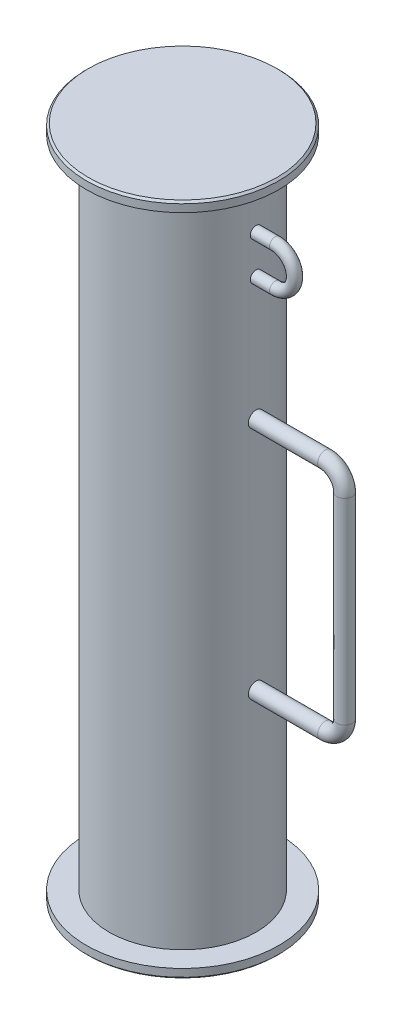
ISO-10303-21;
HEADER;
FILE_DESCRIPTION(('STEP AP214'),'2;1');
FILE_NAME('part.step','',(''),(''),'','','');
FILE_SCHEMA(('AUTOMOTIVE_DESIGN { 1 0 10303 214 1 1 1 1 }'));
ENDSEC;
DATA;
#1=APPLICATION_CONTEXT('core data for automotive mechanical design processes');
#2=APPLICATION_PROTOCOL_DEFINITION('international standard','automotive_design',2000,#1);
#3=PRODUCT_CONTEXT('',#1,'mechanical');
#4=PRODUCT('Part','Part','',(#3));
#5=PRODUCT_RELATED_PRODUCT_CATEGORY('part','',(#4));
#6=PRODUCT_DEFINITION_FORMATION('','',#4);
#7=PRODUCT_DEFINITION_CONTEXT('part definition',#1,'design');
#8=PRODUCT_DEFINITION('design','',#6,#7);
#9=PRODUCT_DEFINITION_SHAPE('','',#8);
#10=(LENGTH_UNIT() NAMED_UNIT(*) SI_UNIT(.MILLI.,.METRE.));
#11=(NAMED_UNIT(*) PLANE_ANGLE_UNIT() SI_UNIT($,.RADIAN.));
#12=(NAMED_UNIT(*) SI_UNIT($,.STERADIAN.) SOLID_ANGLE_UNIT());
#13=UNCERTAINTY_MEASURE_WITH_UNIT(LENGTH_MEASURE(1.E-05),#10,'distance_accuracy_value','');
#14=(GEOMETRIC_REPRESENTATION_CONTEXT(3) GLOBAL_UNCERTAINTY_ASSIGNED_CONTEXT((#13)) GLOBAL_UNIT_ASSIGNED_CONTEXT((#10,
#11,#12)) REPRESENTATION_CONTEXT('',''));
#15=CARTESIAN_POINT('',(0.,0.,0.));
#16=DIRECTION('',(0.,0.,1.));
#17=DIRECTION('',(1.,0.,0.));
#18=AXIS2_PLACEMENT_3D('',#15,#16,#17);
#19=CARTESIAN_POINT('',(48.15,-30.,0.));
#20=DIRECTION('',(-1.,0.,0.));
#21=DIRECTION('',(0.,-1.,0.));
#22=AXIS2_PLACEMENT_3D('',#19,#20,#21);
#23=CYLINDRICAL_SURFACE('',#22,3.);
#24=CARTESIAN_POINT('',(48.15,-30.,0.));
#25=DIRECTION('',(-1.,0.,0.));
#26=DIRECTION('',(0.,0.,-1.));
#27=AXIS2_PLACEMENT_3D('',#24,#25,#26);
#28=CIRCLE('',#27,3.);
#29=CARTESIAN_POINT('',(48.15,-27.,0.));
#30=VERTEX_POINT('',#29);
#31=EDGE_CURVE('E49',#30,#30,#28,.T.);
#32=ORIENTED_EDGE('',*,*,#31,.T.);
#33=EDGE_LOOP('',(#32));
#34=FACE_BOUND('',#33,.T.);
#35=CARTESIAN_POINT('',(38.15,-30.,0.));
#36=DIRECTION('',(-1.,0.,0.));
#37=DIRECTION('',(0.,0.,-1.));
#38=AXIS2_PLACEMENT_3D('',#35,#36,#37);
#39=CIRCLE('',#38,3.);
#40=CARTESIAN_POINT('',(38.15,-30.,-3.));
#41=VERTEX_POINT('',#40);
#42=EDGE_CURVE('E11',#41,#41,#39,.T.);
#43=ORIENTED_EDGE('',*,*,#42,.F.);
#44=EDGE_LOOP('',(#43));
#45=FACE_BOUND('',#44,.T.);
#46=ADVANCED_FACE('F43',(#34,#45),#23,.T.);
#47=CARTESIAN_POINT('',(48.15,-40.,0.));
#48=DIRECTION('',(0.,0.,1.));
#49=DIRECTION('',(1.,0.,0.));
#50=AXIS2_PLACEMENT_3D('',#47,#48,#49);
#51=TOROIDAL_SURFACE('',#50,9.99999999999999,3.);
#52=CARTESIAN_POINT('',(48.15,-50.,0.));
#53=DIRECTION('',(1.,0.,0.));
#54=DIRECTION('',(0.,0.,-1.));
#55=AXIS2_PLACEMENT_3D('',#52,#53,#54);
#56=CIRCLE('',#55,3.);
#57=CARTESIAN_POINT('',(48.15,-53.,0.));
#58=VERTEX_POINT('',#57);
#59=EDGE_CURVE('E53',#58,#58,#56,.T.);
#60=CARTESIAN_POINT('',(48.15,-40.,0.));
#61=DIRECTION('',(0.,0.,1.));
#62=DIRECTION('',(1.,0.,0.));
#63=AXIS2_PLACEMENT_3D('',#60,#61,#62);
#64=CIRCLE('',#63,13.);
#65=EDGE_CURVE('',#58,#30,#64,.T.);
#66=ORIENTED_EDGE('',*,*,#59,.T.);
#67=ORIENTED_EDGE('',*,*,#31,.F.);
#68=ORIENTED_EDGE('',*,*,#65,.T.);
#69=ORIENTED_EDGE('',*,*,#65,.F.);
#70=EDGE_LOOP('',(#66,#68,#67,#69));
#71=FACE_BOUND('',#70,.T.);
#72=ADVANCED_FACE('F75',(#71),#51,.T.);
#73=CARTESIAN_POINT('',(48.15,-50.,0.));
#74=DIRECTION('',(-1.,0.,0.));
#75=DIRECTION('',(0.,0.,1.));
#76=AXIS2_PLACEMENT_3D('',#73,#74,#75);
#77=CYLINDRICAL_SURFACE('',#76,3.);
#78=ORIENTED_EDGE('',*,*,#59,.F.);
#79=EDGE_LOOP('',(#78));
#80=FACE_BOUND('',#79,.T.);
#81=CARTESIAN_POINT('',(38.15,-50.,0.));
#82=DIRECTION('',(1.,0.,0.));
#83=DIRECTION('',(0.,0.,-1.));
#84=AXIS2_PLACEMENT_3D('',#81,#82,#83);
#85=CIRCLE('',#84,3.);
#86=CARTESIAN_POINT('',(38.15,-50.,-3.));
#87=VERTEX_POINT('',#86);
#88=EDGE_CURVE('E57',#87,#87,#85,.T.);
#89=ORIENTED_EDGE('',*,*,#88,.T.);
#90=EDGE_LOOP('',(#89));
#91=FACE_BOUND('',#90,.T.);
#92=ADVANCED_FACE('F63',(#80,#91),#77,.T.);
#93=CARTESIAN_POINT('',(38.15,-30.,0.));
#94=DIRECTION('',(-1.,0.,0.));
#95=DIRECTION('',(0.,0.,-1.));
#96=AXIS2_PLACEMENT_3D('',#93,#94,#95);
#97=PLANE('',#96);
#98=ORIENTED_EDGE('',*,*,#42,.T.);
#99=EDGE_LOOP('',(#98));
#100=FACE_BOUND('',#99,.T.);
#101=ADVANCED_FACE('F67',(#100),#97,.T.);
#102=CARTESIAN_POINT('',(38.15,-50.,0.));
#103=DIRECTION('',(1.,0.,0.));
#104=DIRECTION('',(0.,0.,-1.));
#105=AXIS2_PLACEMENT_3D('',#102,#103,#104);
#106=PLANE('',#105);
#107=ORIENTED_EDGE('',*,*,#88,.F.);
#108=EDGE_LOOP('',(#107));
#109=FACE_BOUND('',#108,.T.);
#110=ADVANCED_FACE('F65',(#109),#106,.F.);
#111=CLOSED_SHELL('',(#46,#72,#92,#101,#110));
#112=MANIFOLD_SOLID_BREP('B2',#111);
#113=CARTESIAN_POINT('',(74.15,-236.,0.));
#114=DIRECTION('',(-1.,0.,0.));
#115=DIRECTION('',(0.,0.,1.));
#116=AXIS2_PLACEMENT_3D('',#113,#114,#115);
#117=CYLINDRICAL_SURFACE('',#116,4.00000000000001);
#118=CARTESIAN_POINT('',(74.15,-236.,0.));
#119=DIRECTION('',(-1.,0.,0.));
#120=DIRECTION('',(0.,0.,-1.));
#121=AXIS2_PLACEMENT_3D('',#118,#119,#120);
#122=CIRCLE('',#121,4.00000000000001);
#123=CARTESIAN_POINT('',(74.15,-240.,0.));
#124=VERTEX_POINT('',#123);
#125=EDGE_CURVE('E126',#124,#124,#122,.T.);
#126=ORIENTED_EDGE('',*,*,#125,.T.);
#127=EDGE_LOOP('',(#126));
#128=FACE_BOUND('',#127,.T.);
#129=CARTESIAN_POINT('',(38.15,-236.,0.));
#130=DIRECTION('',(-1.,0.,0.));
#131=DIRECTION('',(0.,0.,-1.));
#132=AXIS2_PLACEMENT_3D('',#129,#130,#131);
#133=CIRCLE('',#132,4.00000000000001);
#134=CARTESIAN_POINT('',(38.15,-236.,-4.00000000000001));
#135=VERTEX_POINT('',#134);
#136=EDGE_CURVE('E42',#135,#135,#133,.T.);
#137=ORIENTED_EDGE('',*,*,#136,.F.);
#138=EDGE_LOOP('',(#137));
#139=FACE_BOUND('',#138,.T.);
#140=ADVANCED_FACE('F120',(#128,#139),#117,.T.);
#141=CARTESIAN_POINT('',(74.15,-226.,0.));
#142=DIRECTION('',(0.,0.,-1.));
#143=DIRECTION('',(-1.,0.,0.));
#144=AXIS2_PLACEMENT_3D('',#141,#142,#143);
#145=TOROIDAL_SURFACE('',#144,9.99999999999997,4.00000000000001);
#146=CARTESIAN_POINT('',(84.15,-226.,0.));
#147=DIRECTION('',(0.,-1.,0.));
#148=DIRECTION('',(0.,0.,-1.));
#149=AXIS2_PLACEMENT_3D('',#146,#147,#148);
#150=CIRCLE('',#149,4.00000000000001);
#151=CARTESIAN_POINT('',(88.15,-226.,0.));
#152=VERTEX_POINT('',#151);
#153=EDGE_CURVE('E130',#152,#152,#150,.T.);
#154=CARTESIAN_POINT('',(74.15,-226.,0.));
#155=DIRECTION('',(0.,0.,-1.));
#156=DIRECTION('',(-1.,0.,0.));
#157=AXIS2_PLACEMENT_3D('',#154,#155,#156);
#158=CIRCLE('',#157,14.);
#159=EDGE_CURVE('',#152,#124,#158,.T.);
#160=ORIENTED_EDGE('',*,*,#153,.T.);
#161=ORIENTED_EDGE('',*,*,#125,.F.);
#162=ORIENTED_EDGE('',*,*,#159,.T.);
#163=ORIENTED_EDGE('',*,*,#159,.F.);
#164=EDGE_LOOP('',(#160,#162,#161,#163));
#165=FACE_BOUND('',#164,.T.);
#166=ADVANCED_FACE('F164',(#165),#145,.T.);
#167=CARTESIAN_POINT('',(84.15,-124.,0.));
#168=DIRECTION('',(0.,-1.,0.));
#169=DIRECTION('',(0.,0.,-1.));
#170=AXIS2_PLACEMENT_3D('',#167,#168,#169);
#171=CYLINDRICAL_SURFACE('',#170,4.00000000000001);
#172=CARTESIAN_POINT('',(84.15,-124.,0.));
#173=DIRECTION('',(0.,-1.,0.));
#174=DIRECTION('',(0.,0.,-1.));
#175=AXIS2_PLACEMENT_3D('',#172,#173,#174);
#176=CIRCLE('',#175,4.00000000000001);
#177=CARTESIAN_POINT('',(88.15,-124.,0.));
#178=VERTEX_POINT('',#177);
#179=EDGE_CURVE('E134',#178,#178,#176,.T.);
#180=ORIENTED_EDGE('',*,*,#179,.T.);
#181=EDGE_LOOP('',(#180));
#182=FACE_BOUND('',#181,.T.);
#183=ORIENTED_EDGE('',*,*,#153,.F.);
#184=EDGE_LOOP('',(#183));
#185=FACE_BOUND('',#184,.T.);
#186=ADVANCED_FACE('F168',(#182,#185),#171,.T.);
#187=CARTESIAN_POINT('',(74.15,-124.,0.));
#188=DIRECTION('',(0.,0.,-1.));
#189=DIRECTION('',(-1.,0.,0.));
#190=AXIS2_PLACEMENT_3D('',#187,#188,#189);
#191=TOROIDAL_SURFACE('',#190,9.99999999999999,4.00000000000001);
#192=CARTESIAN_POINT('',(74.15,-114.,0.));
#193=DIRECTION('',(1.,0.,0.));
#194=DIRECTION('',(0.,0.,-1.));
#195=AXIS2_PLACEMENT_3D('',#192,#193,#194);
#196=CIRCLE('',#195,4.00000000000001);
#197=CARTESIAN_POINT('',(74.15,-110.,0.));
#198=VERTEX_POINT('',#197);
#199=EDGE_CURVE('E139',#198,#198,#196,.T.);
#200=CARTESIAN_POINT('',(74.15,-124.,0.));
#201=DIRECTION('',(0.,0.,-1.));
#202=DIRECTION('',(-1.,0.,0.));
#203=AXIS2_PLACEMENT_3D('',#200,#201,#202);
#204=CIRCLE('',#203,14.);
#205=EDGE_CURVE('',#198,#178,#204,.T.);
#206=ORIENTED_EDGE('',*,*,#199,.T.);
#207=ORIENTED_EDGE('',*,*,#179,.F.);
#208=ORIENTED_EDGE('',*,*,#205,.T.);
#209=ORIENTED_EDGE('',*,*,#205,.F.);
#210=EDGE_LOOP('',(#206,#208,#207,#209));
#211=FACE_BOUND('',#210,.T.);
#212=ADVANCED_FACE('F146',(#211),#191,.T.);
#213=CARTESIAN_POINT('',(74.15,-114.,0.));
#214=DIRECTION('',(-1.,0.,0.));
#215=DIRECTION('',(0.,0.,1.));
#216=AXIS2_PLACEMENT_3D('',#213,#214,#215);
#217=CYLINDRICAL_SURFACE('',#216,4.00000000000001);
#218=ORIENTED_EDGE('',*,*,#199,.F.);
#219=EDGE_LOOP('',(#218));
#220=FACE_BOUND('',#219,.T.);
#221=CARTESIAN_POINT('',(38.15,-114.,0.));
#222=DIRECTION('',(1.,0.,0.));
#223=DIRECTION('',(0.,0.,-1.));
#224=AXIS2_PLACEMENT_3D('',#221,#222,#223);
#225=CIRCLE('',#224,4.00000000000001);
#226=CARTESIAN_POINT('',(38.15,-114.,-4.00000000000001));
#227=VERTEX_POINT('',#226);
#228=EDGE_CURVE('E140',#227,#227,#225,.T.);
#229=ORIENTED_EDGE('',*,*,#228,.T.);
#230=EDGE_LOOP('',(#229));
#231=FACE_BOUND('',#230,.T.);
#232=ADVANCED_FACE('F149',(#220,#231),#217,.T.);
#233=CARTESIAN_POINT('',(38.15,-236.,0.));
#234=DIRECTION('',(-1.,0.,0.));
#235=DIRECTION('',(0.,0.,-1.));
#236=AXIS2_PLACEMENT_3D('',#233,#234,#235);
#237=PLANE('',#236);
#238=ORIENTED_EDGE('',*,*,#136,.T.);
#239=EDGE_LOOP('',(#238));
#240=FACE_BOUND('',#239,.T.);
#241=ADVANCED_FACE('F152',(#240),#237,.T.);
#242=CARTESIAN_POINT('',(38.15,-114.,0.));
#243=DIRECTION('',(1.,0.,0.));
#244=DIRECTION('',(0.,0.,-1.));
#245=AXIS2_PLACEMENT_3D('',#242,#243,#244);
#246=PLANE('',#245);
#247=ORIENTED_EDGE('',*,*,#228,.F.);
#248=EDGE_LOOP('',(#247));
#249=FACE_BOUND('',#248,.T.);
#250=ADVANCED_FACE('F156',(#249),#246,.F.);
#251=CLOSED_SHELL('',(#140,#166,#186,#212,#232,#241,#250));
#252=MANIFOLD_SOLID_BREP('B6',#251);
#253=CARTESIAN_POINT('',(0.,-5.,0.));
#254=DIRECTION('',(0.,1.,0.));
#255=DIRECTION('',(0.,0.,1.));
#256=AXIS2_PLACEMENT_3D('',#253,#254,#255);
#257=PLANE('',#256);
#258=CARTESIAN_POINT('',(0.,-5.,0.));
#259=DIRECTION('',(0.,1.,0.));
#260=DIRECTION('',(0.,0.,1.));
#261=AXIS2_PLACEMENT_3D('',#258,#259,#260);
#262=CIRCLE('',#261,50.);
#263=CARTESIAN_POINT('',(0.,-5.,50.));
#264=VERTEX_POINT('',#263);
#265=EDGE_CURVE('E245',#264,#264,#262,.T.);
#266=ORIENTED_EDGE('',*,*,#265,.F.);
#267=EDGE_LOOP('',(#266));
#268=FACE_BOUND('',#267,.T.);
#269=CARTESIAN_POINT('',(0.,-5.,0.));
#270=DIRECTION('',(0.,1.,0.));
#271=DIRECTION('',(0.,0.,1.));
#272=AXIS2_PLACEMENT_3D('',#269,#270,#271);
#273=CIRCLE('',#272,38.15);
#274=CARTESIAN_POINT('',(0.,-5.,38.15));
#275=VERTEX_POINT('',#274);
#276=EDGE_CURVE('E242',#275,#275,#273,.F.);
#277=ORIENTED_EDGE('',*,*,#276,.F.);
#278=EDGE_LOOP('',(#277));
#279=FACE_BOUND('',#278,.T.);
#280=ADVANCED_FACE('F221',(#268,#279),#257,.F.);
#281=CARTESIAN_POINT('',(0.,-5.,0.));
#282=DIRECTION('',(0.,1.,0.));
#283=DIRECTION('',(0.,0.,1.));
#284=AXIS2_PLACEMENT_3D('',#281,#282,#283);
#285=CYLINDRICAL_SURFACE('',#284,50.);
#286=CARTESIAN_POINT('',(0.,-1.00000000000001,0.));
#287=DIRECTION('',(0.,1.,0.));
#288=DIRECTION('',(0.,0.,1.));
#289=AXIS2_PLACEMENT_3D('',#286,#287,#288);
#290=CIRCLE('',#289,50.);
#291=CARTESIAN_POINT('',(0.,-1.00000000000001,50.));
#292=VERTEX_POINT('',#291);
#293=EDGE_CURVE('E119',#292,#292,#290,.F.);
#294=ORIENTED_EDGE('',*,*,#293,.T.);
#295=EDGE_LOOP('',(#294));
#296=FACE_BOUND('',#295,.T.);
#297=ORIENTED_EDGE('',*,*,#265,.T.);
#298=EDGE_LOOP('',(#297));
#299=FACE_BOUND('',#298,.T.);
#300=ADVANCED_FACE('F278',(#296,#299),#285,.T.);
#301=CARTESIAN_POINT('',(0.,0.,0.));
#302=DIRECTION('',(0.,1.,0.));
#303=DIRECTION('',(0.,0.,1.));
#304=AXIS2_PLACEMENT_3D('',#301,#302,#303);
#305=PLANE('',#304);
#306=CARTESIAN_POINT('',(0.,0.,0.));
#307=DIRECTION('',(0.,1.,0.));
#308=DIRECTION('',(0.,0.,1.));
#309=AXIS2_PLACEMENT_3D('',#306,#307,#308);
#310=CIRCLE('',#309,49.);
#311=CARTESIAN_POINT('',(0.,0.,49.));
#312=VERTEX_POINT('',#311);
#313=EDGE_CURVE('E229',#312,#312,#310,.T.);
#314=ORIENTED_EDGE('',*,*,#313,.T.);
#315=EDGE_LOOP('',(#314));
#316=FACE_BOUND('',#315,.T.);
#317=ADVANCED_FACE('F273',(#316),#305,.T.);
#318=CARTESIAN_POINT('',(0.,-345.,0.));
#319=DIRECTION('',(0.,1.,0.));
#320=DIRECTION('',(0.,0.,1.));
#321=AXIS2_PLACEMENT_3D('',#318,#319,#320);
#322=CYLINDRICAL_SURFACE('',#321,38.15);
#323=CARTESIAN_POINT('',(0.,-345.,0.));
#324=DIRECTION('',(0.,-1.,0.));
#325=DIRECTION('',(0.,0.,-1.));
#326=AXIS2_PLACEMENT_3D('',#323,#324,#325);
#327=CIRCLE('',#326,38.15);
#328=CARTESIAN_POINT('',(0.,-345.,-38.15));
#329=VERTEX_POINT('',#328);
#330=EDGE_CURVE('E248',#329,#329,#327,.T.);
#331=ORIENTED_EDGE('',*,*,#330,.F.);
#332=EDGE_LOOP('',(#331));
#333=FACE_BOUND('',#332,.T.);
#334=ORIENTED_EDGE('',*,*,#276,.T.);
#335=EDGE_LOOP('',(#334));
#336=FACE_BOUND('',#335,.T.);
#337=ADVANCED_FACE('F266',(#333,#336),#322,.T.);
#338=CARTESIAN_POINT('',(0.,-345.,0.));
#339=DIRECTION('',(0.,-1.,0.));
#340=DIRECTION('',(0.,0.,-1.));
#341=AXIS2_PLACEMENT_3D('',#338,#339,#340);
#342=PLANE('',#341);
#343=CARTESIAN_POINT('',(0.,-345.,0.));
#344=DIRECTION('',(0.,-1.,0.));
#345=DIRECTION('',(0.,0.,-1.));
#346=AXIS2_PLACEMENT_3D('',#343,#344,#345);
#347=CIRCLE('',#346,50.);
#348=CARTESIAN_POINT('',(0.,-345.,-50.));
#349=VERTEX_POINT('',#348);
#350=EDGE_CURVE('E257',#349,#349,#347,.T.);
#351=ORIENTED_EDGE('',*,*,#350,.F.);
#352=EDGE_LOOP('',(#351));
#353=FACE_BOUND('',#352,.T.);
#354=ORIENTED_EDGE('',*,*,#330,.T.);
#355=EDGE_LOOP('',(#354));
#356=FACE_BOUND('',#355,.T.);
#357=ADVANCED_FACE('F263',(#353,#356),#342,.F.);
#358=CARTESIAN_POINT('',(0.,-350.,0.));
#359=DIRECTION('',(0.,1.,0.));
#360=DIRECTION('',(0.,0.,1.));
#361=AXIS2_PLACEMENT_3D('',#358,#359,#360);
#362=CYLINDRICAL_SURFACE('',#361,50.);
#363=CARTESIAN_POINT('',(0.,-349.,0.));
#364=DIRECTION('',(0.,-1.,0.));
#365=DIRECTION('',(0.,0.,-1.));
#366=AXIS2_PLACEMENT_3D('',#363,#364,#365);
#367=CIRCLE('',#366,50.);
#368=CARTESIAN_POINT('',(0.,-349.,-50.));
#369=VERTEX_POINT('',#368);
#370=EDGE_CURVE('E233',#369,#369,#367,.F.);
#371=ORIENTED_EDGE('',*,*,#370,.T.);
#372=EDGE_LOOP('',(#371));
#373=FACE_BOUND('',#372,.T.);
#374=ORIENTED_EDGE('',*,*,#350,.T.);
#375=EDGE_LOOP('',(#374));
#376=FACE_BOUND('',#375,.T.);
#377=ADVANCED_FACE('F261',(#373,#376),#362,.T.);
#378=CARTESIAN_POINT('',(0.,-350.,0.));
#379=DIRECTION('',(0.,-1.,0.));
#380=DIRECTION('',(0.,0.,-1.));
#381=AXIS2_PLACEMENT_3D('',#378,#379,#380);
#382=PLANE('',#381);
#383=CARTESIAN_POINT('',(0.,-350.,0.));
#384=DIRECTION('',(0.,-1.,0.));
#385=DIRECTION('',(0.,0.,-1.));
#386=AXIS2_PLACEMENT_3D('',#383,#384,#385);
#387=CIRCLE('',#386,49.);
#388=CARTESIAN_POINT('',(0.,-350.,-49.));
#389=VERTEX_POINT('',#388);
#390=EDGE_CURVE('E237',#389,#389,#387,.T.);
#391=ORIENTED_EDGE('',*,*,#390,.T.);
#392=EDGE_LOOP('',(#391));
#393=FACE_BOUND('',#392,.T.);
#394=ADVANCED_FACE('F306',(#393),#382,.T.);
#395=CARTESIAN_POINT('',(0.,-350.,0.));
#396=DIRECTION('',(0.,1.,0.));
#397=DIRECTION('',(0.,0.,1.));
#398=AXIS2_PLACEMENT_3D('',#395,#396,#397);
#399=CONICAL_SURFACE('',#398,49.,0.785398163397448);
#400=ORIENTED_EDGE('',*,*,#370,.F.);
#401=EDGE_LOOP('',(#400));
#402=FACE_BOUND('',#401,.T.);
#403=ORIENTED_EDGE('',*,*,#390,.F.);
#404=EDGE_LOOP('',(#403));
#405=FACE_BOUND('',#404,.T.);
#406=ADVANCED_FACE('F310',(#402,#405),#399,.T.);
#407=CARTESIAN_POINT('',(0.,0.,0.));
#408=DIRECTION('',(0.,-1.,0.));
#409=DIRECTION('',(0.,0.,-1.));
#410=AXIS2_PLACEMENT_3D('',#407,#408,#409);
#411=CONICAL_SURFACE('',#410,49.,0.785398163397441);
#412=ORIENTED_EDGE('',*,*,#293,.F.);
#413=EDGE_LOOP('',(#412));
#414=FACE_BOUND('',#413,.T.);
#415=ORIENTED_EDGE('',*,*,#313,.F.);
#416=EDGE_LOOP('',(#415));
#417=FACE_BOUND('',#416,.T.);
#418=ADVANCED_FACE('F223',(#414,#417),#411,.T.);
#419=CLOSED_SHELL('',(#280,#300,#317,#337,#357,#377,#394,#406,#418));
#420=CARTESIAN_POINT('',(0.,-5.,0.));
#421=DIRECTION('',(0.,-1.,0.));
#422=DIRECTION('',(0.,0.,-1.));
#423=AXIS2_PLACEMENT_3D('',#420,#421,#422);
#424=CIRCLE('',#423,33.95);
#425=CARTESIAN_POINT('',(0.,-5.,-33.95));
#426=VERTEX_POINT('',#425);
#427=EDGE_CURVE('E251',#426,#426,#424,.T.);
#428=ORIENTED_EDGE('',*,*,#427,.T.);
#429=EDGE_LOOP('',(#428));
#430=FACE_BOUND('',#429,.T.);
#431=ADVANCED_FACE('F281',(#430),#257,.F.);
#432=CARTESIAN_POINT('',(0.,-345.,0.));
#433=DIRECTION('',(0.,1.,0.));
#434=DIRECTION('',(0.,0.,1.));
#435=AXIS2_PLACEMENT_3D('',#432,#433,#434);
#436=CYLINDRICAL_SURFACE('',#435,33.95);
#437=CARTESIAN_POINT('',(0.,-345.,0.));
#438=DIRECTION('',(0.,-1.,0.));
#439=DIRECTION('',(0.,0.,-1.));
#440=AXIS2_PLACEMENT_3D('',#437,#438,#439);
#441=CIRCLE('',#440,33.95);
#442=CARTESIAN_POINT('',(0.,-345.,-33.95));
#443=VERTEX_POINT('',#442);
#444=EDGE_CURVE('E254',#443,#443,#441,.T.);
#445=ORIENTED_EDGE('',*,*,#444,.T.);
#446=EDGE_LOOP('',(#445));
#447=FACE_BOUND('',#446,.T.);
#448=ORIENTED_EDGE('',*,*,#427,.F.);
#449=EDGE_LOOP('',(#448));
#450=FACE_BOUND('',#449,.T.);
#451=ADVANCED_FACE('F289',(#447,#450),#436,.F.);
#452=ORIENTED_EDGE('',*,*,#444,.F.);
#453=EDGE_LOOP('',(#452));
#454=FACE_BOUND('',#453,.T.);
#455=ADVANCED_FACE('F268',(#454),#342,.F.);
#456=CLOSED_SHELL('',(#431,#451,#455));
#457=ORIENTED_CLOSED_SHELL('',*,#456,.T.);
#458=BREP_WITH_VOIDS('B37',#419,(#457));
#459=ADVANCED_BREP_SHAPE_REPRESENTATION('',(#18,#112,#252,#458),#14);
#460=SHAPE_DEFINITION_REPRESENTATION(#9,#459);
ENDSEC;
END-ISO-10303-21;
